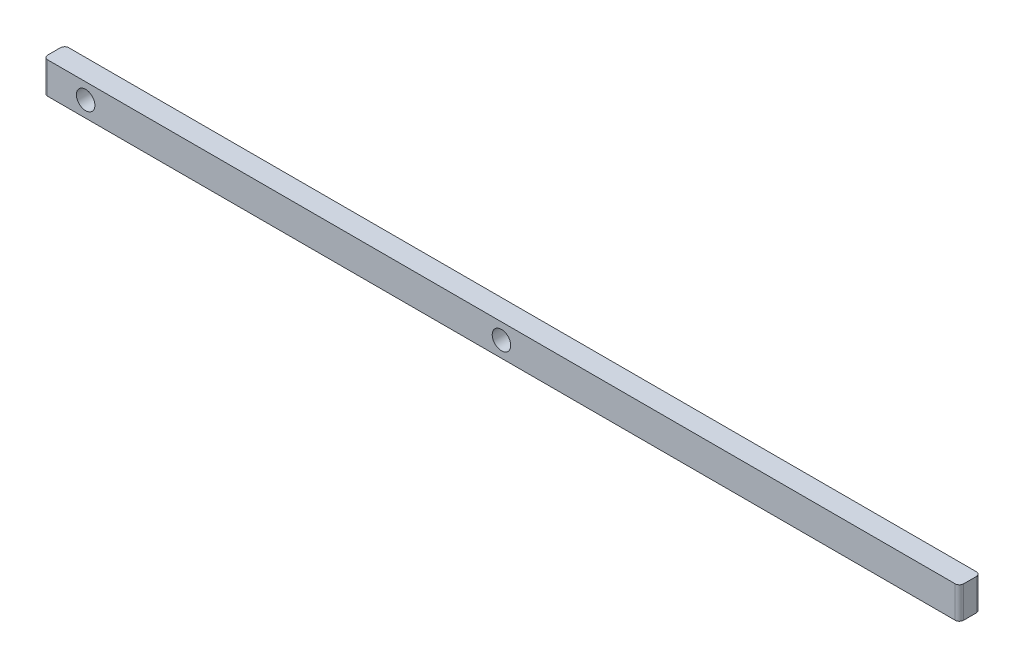
ISO-10303-21;
HEADER;
FILE_DESCRIPTION(('STEP AP214'),'2;1');
FILE_NAME('part.step','',(''),(''),'','','');
FILE_SCHEMA(('AUTOMOTIVE_DESIGN { 1 0 10303 214 1 1 1 1 }'));
ENDSEC;
DATA;
#1=APPLICATION_CONTEXT('core data for automotive mechanical design processes');
#2=APPLICATION_PROTOCOL_DEFINITION('international standard','automotive_design',2000,#1);
#3=PRODUCT_CONTEXT('',#1,'mechanical');
#4=PRODUCT('Part','Part','',(#3));
#5=PRODUCT_RELATED_PRODUCT_CATEGORY('part','',(#4));
#6=PRODUCT_DEFINITION_FORMATION('','',#4);
#7=PRODUCT_DEFINITION_CONTEXT('part definition',#1,'design');
#8=PRODUCT_DEFINITION('design','',#6,#7);
#9=PRODUCT_DEFINITION_SHAPE('','',#8);
#10=(LENGTH_UNIT() NAMED_UNIT(*) SI_UNIT(.MILLI.,.METRE.));
#11=(NAMED_UNIT(*) PLANE_ANGLE_UNIT() SI_UNIT($,.RADIAN.));
#12=(NAMED_UNIT(*) SI_UNIT($,.STERADIAN.) SOLID_ANGLE_UNIT());
#13=UNCERTAINTY_MEASURE_WITH_UNIT(LENGTH_MEASURE(1.E-05),#10,'distance_accuracy_value','');
#14=(GEOMETRIC_REPRESENTATION_CONTEXT(3) GLOBAL_UNCERTAINTY_ASSIGNED_CONTEXT((#13)) GLOBAL_UNIT_ASSIGNED_CONTEXT((#10,
#11,#12)) REPRESENTATION_CONTEXT('',''));
#15=CARTESIAN_POINT('',(0.,0.,0.));
#16=DIRECTION('',(0.,0.,1.));
#17=DIRECTION('',(1.,0.,0.));
#18=AXIS2_PLACEMENT_3D('',#15,#16,#17);
#19=CARTESIAN_POINT('',(276.225,-9.525,6.35));
#20=DIRECTION('',(-1.,0.,0.));
#21=DIRECTION('',(0.,0.,1.));
#22=AXIS2_PLACEMENT_3D('',#19,#20,#21);
#23=PLANE('',#22);
#24=DIRECTION('',(0.,0.,-1.));
#25=VECTOR('',#24,1.);
#26=CARTESIAN_POINT('',(276.225,-9.525,6.35));
#27=LINE('',#26,#25);
#28=CARTESIAN_POINT('',(276.225,-9.525,3.81));
#29=VERTEX_POINT('',#28);
#30=CARTESIAN_POINT('',(276.225,-9.525,-3.81));
#31=VERTEX_POINT('',#30);
#32=EDGE_CURVE('E124',#29,#31,#27,.T.);
#33=ORIENTED_EDGE('',*,*,#32,.T.);
#34=DIRECTION('',(0.,1.,0.));
#35=VECTOR('',#34,1.);
#36=CARTESIAN_POINT('',(276.225,9.525,-3.81));
#37=LINE('',#36,#35);
#38=CARTESIAN_POINT('',(276.225,9.525,-3.81));
#39=VERTEX_POINT('',#38);
#40=EDGE_CURVE('E11',#31,#39,#37,.T.);
#41=ORIENTED_EDGE('',*,*,#40,.T.);
#42=DIRECTION('',(0.,0.,-1.));
#43=VECTOR('',#42,1.);
#44=CARTESIAN_POINT('',(276.225,9.525,6.35));
#45=LINE('',#44,#43);
#46=CARTESIAN_POINT('',(276.225,9.525,3.81));
#47=VERTEX_POINT('',#46);
#48=EDGE_CURVE('E129',#47,#39,#45,.T.);
#49=ORIENTED_EDGE('',*,*,#48,.F.);
#50=DIRECTION('',(0.,1.,0.));
#51=VECTOR('',#50,1.);
#52=CARTESIAN_POINT('',(276.225,-9.525,3.81));
#53=LINE('',#52,#51);
#54=EDGE_CURVE('E44',#47,#29,#53,.F.);
#55=ORIENTED_EDGE('',*,*,#54,.T.);
#56=EDGE_LOOP('',(#33,#41,#49,#55));
#57=FACE_BOUND('',#56,.T.);
#58=ADVANCED_FACE('F36',(#57),#23,.F.);
#59=CARTESIAN_POINT('',(-276.225,9.525,6.35));
#60=DIRECTION('',(0.,-1.,0.));
#61=DIRECTION('',(0.,0.,-1.));
#62=AXIS2_PLACEMENT_3D('',#59,#60,#61);
#63=PLANE('',#62);
#64=DIRECTION('',(-1.,0.,0.));
#65=VECTOR('',#64,1.);
#66=CARTESIAN_POINT('',(-276.225,9.525,-6.35));
#67=LINE('',#66,#65);
#68=CARTESIAN_POINT('',(273.685,9.525,-6.35));
#69=VERTEX_POINT('',#68);
#70=CARTESIAN_POINT('',(-273.685,9.525,-6.35));
#71=VERTEX_POINT('',#70);
#72=EDGE_CURVE('E171',#69,#71,#67,.T.);
#73=ORIENTED_EDGE('',*,*,#72,.T.);
#74=CARTESIAN_POINT('',(-273.685,9.525,-3.81));
#75=DIRECTION('',(0.,-1.,0.));
#76=DIRECTION('',(0.,0.,-1.));
#77=AXIS2_PLACEMENT_3D('',#74,#75,#76);
#78=CIRCLE('',#77,2.54);
#79=CARTESIAN_POINT('',(-276.225,9.525,-3.81));
#80=VERTEX_POINT('',#79);
#81=EDGE_CURVE('E146',#71,#80,#78,.F.);
#82=ORIENTED_EDGE('',*,*,#81,.T.);
#83=DIRECTION('',(0.,0.,-1.));
#84=VECTOR('',#83,1.);
#85=CARTESIAN_POINT('',(-276.225,9.525,6.35));
#86=LINE('',#85,#84);
#87=CARTESIAN_POINT('',(-276.225,9.525,3.81));
#88=VERTEX_POINT('',#87);
#89=EDGE_CURVE('E123',#88,#80,#86,.T.);
#90=ORIENTED_EDGE('',*,*,#89,.F.);
#91=CARTESIAN_POINT('',(-273.685,9.525,3.81));
#92=DIRECTION('',(0.,-1.,0.));
#93=DIRECTION('',(0.,0.,-1.));
#94=AXIS2_PLACEMENT_3D('',#91,#92,#93);
#95=CIRCLE('',#94,2.54);
#96=CARTESIAN_POINT('',(-273.685,9.525,6.35));
#97=VERTEX_POINT('',#96);
#98=EDGE_CURVE('E128',#88,#97,#95,.F.);
#99=ORIENTED_EDGE('',*,*,#98,.T.);
#100=DIRECTION('',(-1.,0.,0.));
#101=VECTOR('',#100,1.);
#102=CARTESIAN_POINT('',(-276.225,9.525,6.35));
#103=LINE('',#102,#101);
#104=CARTESIAN_POINT('',(273.685,9.525,6.35));
#105=VERTEX_POINT('',#104);
#106=EDGE_CURVE('E165',#105,#97,#103,.T.);
#107=ORIENTED_EDGE('',*,*,#106,.F.);
#108=CARTESIAN_POINT('',(273.685,9.525,3.81));
#109=DIRECTION('',(0.,-1.,0.));
#110=DIRECTION('',(0.,0.,-1.));
#111=AXIS2_PLACEMENT_3D('',#108,#109,#110);
#112=CIRCLE('',#111,2.54);
#113=EDGE_CURVE('E58',#105,#47,#112,.F.);
#114=ORIENTED_EDGE('',*,*,#113,.T.);
#115=ORIENTED_EDGE('',*,*,#48,.T.);
#116=CARTESIAN_POINT('',(273.685,9.525,-3.81));
#117=DIRECTION('',(0.,-1.,0.));
#118=DIRECTION('',(0.,0.,-1.));
#119=AXIS2_PLACEMENT_3D('',#116,#117,#118);
#120=CIRCLE('',#119,2.54);
#121=EDGE_CURVE('E51',#39,#69,#120,.F.);
#122=ORIENTED_EDGE('',*,*,#121,.T.);
#123=EDGE_LOOP('',(#73,#82,#90,#99,#107,#114,#115,#122));
#124=FACE_BOUND('',#123,.T.);
#125=ADVANCED_FACE('F167',(#124),#63,.F.);
#126=CARTESIAN_POINT('',(-276.225,-9.525,6.35));
#127=DIRECTION('',(1.,0.,0.));
#128=DIRECTION('',(0.,0.,-1.));
#129=AXIS2_PLACEMENT_3D('',#126,#127,#128);
#130=PLANE('',#129);
#131=ORIENTED_EDGE('',*,*,#89,.T.);
#132=DIRECTION('',(0.,-1.,0.));
#133=VECTOR('',#132,1.);
#134=CARTESIAN_POINT('',(-276.225,-9.525,-3.81));
#135=LINE('',#134,#133);
#136=CARTESIAN_POINT('',(-276.225,-9.525,-3.81));
#137=VERTEX_POINT('',#136);
#138=EDGE_CURVE('E122',#80,#137,#135,.T.);
#139=ORIENTED_EDGE('',*,*,#138,.T.);
#140=DIRECTION('',(0.,0.,-1.));
#141=VECTOR('',#140,1.);
#142=CARTESIAN_POINT('',(-276.225,-9.525,6.35));
#143=LINE('',#142,#141);
#144=CARTESIAN_POINT('',(-276.225,-9.525,3.81));
#145=VERTEX_POINT('',#144);
#146=EDGE_CURVE('E105',#145,#137,#143,.T.);
#147=ORIENTED_EDGE('',*,*,#146,.F.);
#148=DIRECTION('',(0.,-1.,0.));
#149=VECTOR('',#148,1.);
#150=CARTESIAN_POINT('',(-276.225,-9.525,3.81));
#151=LINE('',#150,#149);
#152=EDGE_CURVE('E119',#145,#88,#151,.F.);
#153=ORIENTED_EDGE('',*,*,#152,.T.);
#154=EDGE_LOOP('',(#131,#139,#147,#153));
#155=FACE_BOUND('',#154,.T.);
#156=ADVANCED_FACE('F118',(#155),#130,.F.);
#157=CARTESIAN_POINT('',(-276.225,-9.525,6.35));
#158=DIRECTION('',(0.,1.,0.));
#159=DIRECTION('',(0.,0.,1.));
#160=AXIS2_PLACEMENT_3D('',#157,#158,#159);
#161=PLANE('',#160);
#162=ORIENTED_EDGE('',*,*,#146,.T.);
#163=CARTESIAN_POINT('',(-273.685,-9.525,-3.81));
#164=DIRECTION('',(0.,1.,0.));
#165=DIRECTION('',(0.,0.,1.));
#166=AXIS2_PLACEMENT_3D('',#163,#164,#165);
#167=CIRCLE('',#166,2.54);
#168=CARTESIAN_POINT('',(-273.685,-9.525,-6.35));
#169=VERTEX_POINT('',#168);
#170=EDGE_CURVE('E112',#137,#169,#167,.F.);
#171=ORIENTED_EDGE('',*,*,#170,.T.);
#172=DIRECTION('',(1.,0.,0.));
#173=VECTOR('',#172,1.);
#174=CARTESIAN_POINT('',(-276.225,-9.525,-6.35));
#175=LINE('',#174,#173);
#176=CARTESIAN_POINT('',(273.685,-9.525,-6.35));
#177=VERTEX_POINT('',#176);
#178=EDGE_CURVE('E168',#169,#177,#175,.T.);
#179=ORIENTED_EDGE('',*,*,#178,.T.);
#180=CARTESIAN_POINT('',(273.685,-9.525,-3.81));
#181=DIRECTION('',(0.,1.,0.));
#182=DIRECTION('',(0.,0.,1.));
#183=AXIS2_PLACEMENT_3D('',#180,#181,#182);
#184=CIRCLE('',#183,2.54);
#185=EDGE_CURVE('E113',#177,#31,#184,.F.);
#186=ORIENTED_EDGE('',*,*,#185,.T.);
#187=ORIENTED_EDGE('',*,*,#32,.F.);
#188=CARTESIAN_POINT('',(273.685,-9.525,3.81));
#189=DIRECTION('',(0.,1.,0.));
#190=DIRECTION('',(0.,0.,1.));
#191=AXIS2_PLACEMENT_3D('',#188,#189,#190);
#192=CIRCLE('',#191,2.54);
#193=CARTESIAN_POINT('',(273.685,-9.525,6.35));
#194=VERTEX_POINT('',#193);
#195=EDGE_CURVE('E131',#29,#194,#192,.F.);
#196=ORIENTED_EDGE('',*,*,#195,.T.);
#197=DIRECTION('',(1.,0.,0.));
#198=VECTOR('',#197,1.);
#199=CARTESIAN_POINT('',(-276.225,-9.525,6.35));
#200=LINE('',#199,#198);
#201=CARTESIAN_POINT('',(-273.685,-9.525,6.35));
#202=VERTEX_POINT('',#201);
#203=EDGE_CURVE('E107',#202,#194,#200,.T.);
#204=ORIENTED_EDGE('',*,*,#203,.F.);
#205=CARTESIAN_POINT('',(-273.685,-9.525,3.81));
#206=DIRECTION('',(0.,1.,0.));
#207=DIRECTION('',(0.,0.,1.));
#208=AXIS2_PLACEMENT_3D('',#205,#206,#207);
#209=CIRCLE('',#208,2.54);
#210=EDGE_CURVE('E102',#202,#145,#209,.F.);
#211=ORIENTED_EDGE('',*,*,#210,.T.);
#212=EDGE_LOOP('',(#162,#171,#179,#186,#187,#196,#204,#211));
#213=FACE_BOUND('',#212,.T.);
#214=ADVANCED_FACE('F104',(#213),#161,.F.);
#215=CARTESIAN_POINT('',(0.,0.,6.35));
#216=DIRECTION('',(0.,0.,-1.));
#217=DIRECTION('',(-1.,0.,0.));
#218=AXIS2_PLACEMENT_3D('',#215,#216,#217);
#219=PLANE('',#218);
#220=CARTESIAN_POINT('',(-250.825,0.,6.35));
#221=DIRECTION('',(0.,0.,-1.));
#222=DIRECTION('',(-1.,0.,0.));
#223=AXIS2_PLACEMENT_3D('',#220,#221,#222);
#224=CIRCLE('',#223,5.58800000000002);
#225=CARTESIAN_POINT('',(-256.413,0.,6.35));
#226=VERTEX_POINT('',#225);
#227=EDGE_CURVE('E174',#226,#226,#224,.T.);
#228=ORIENTED_EDGE('',*,*,#227,.T.);
#229=EDGE_LOOP('',(#228));
#230=FACE_BOUND('',#229,.T.);
#231=CARTESIAN_POINT('',(0.,0.,6.35));
#232=DIRECTION('',(0.,0.,-1.));
#233=DIRECTION('',(-1.,0.,0.));
#234=AXIS2_PLACEMENT_3D('',#231,#232,#233);
#235=CIRCLE('',#234,5.588);
#236=CARTESIAN_POINT('',(-5.588,0.,6.35));
#237=VERTEX_POINT('',#236);
#238=EDGE_CURVE('E295',#237,#237,#235,.T.);
#239=ORIENTED_EDGE('',*,*,#238,.T.);
#240=EDGE_LOOP('',(#239));
#241=FACE_BOUND('',#240,.T.);
#242=ORIENTED_EDGE('',*,*,#106,.T.);
#243=DIRECTION('',(0.,-1.,0.));
#244=VECTOR('',#243,1.);
#245=CARTESIAN_POINT('',(-273.685,0.,6.35));
#246=LINE('',#245,#244);
#247=EDGE_CURVE('E151',#97,#202,#246,.T.);
#248=ORIENTED_EDGE('',*,*,#247,.T.);
#249=ORIENTED_EDGE('',*,*,#203,.T.);
#250=DIRECTION('',(0.,1.,0.));
#251=VECTOR('',#250,1.);
#252=CARTESIAN_POINT('',(273.685,0.,6.35));
#253=LINE('',#252,#251);
#254=EDGE_CURVE('E148',#194,#105,#253,.T.);
#255=ORIENTED_EDGE('',*,*,#254,.T.);
#256=EDGE_LOOP('',(#242,#248,#249,#255));
#257=FACE_BOUND('',#256,.T.);
#258=ADVANCED_FACE('F164',(#230,#241,#257),#219,.F.);
#259=CARTESIAN_POINT('',(0.,0.,-6.35));
#260=DIRECTION('',(0.,0.,-1.));
#261=DIRECTION('',(-1.,0.,0.));
#262=AXIS2_PLACEMENT_3D('',#259,#260,#261);
#263=PLANE('',#262);
#264=CARTESIAN_POINT('',(-250.825,0.,-6.35));
#265=DIRECTION('',(0.,0.,1.));
#266=DIRECTION('',(1.,0.,0.));
#267=AXIS2_PLACEMENT_3D('',#264,#265,#266);
#268=CIRCLE('',#267,5.58800000000002);
#269=CARTESIAN_POINT('',(-245.237,0.,-6.35));
#270=VERTEX_POINT('',#269);
#271=EDGE_CURVE('E290',#270,#270,#268,.T.);
#272=ORIENTED_EDGE('',*,*,#271,.T.);
#273=EDGE_LOOP('',(#272));
#274=FACE_BOUND('',#273,.T.);
#275=CARTESIAN_POINT('',(0.,0.,-6.35));
#276=DIRECTION('',(0.,0.,1.));
#277=DIRECTION('',(1.,0.,0.));
#278=AXIS2_PLACEMENT_3D('',#275,#276,#277);
#279=CIRCLE('',#278,5.588);
#280=CARTESIAN_POINT('',(5.588,0.,-6.35));
#281=VERTEX_POINT('',#280);
#282=EDGE_CURVE('E293',#281,#281,#279,.T.);
#283=ORIENTED_EDGE('',*,*,#282,.T.);
#284=EDGE_LOOP('',(#283));
#285=FACE_BOUND('',#284,.T.);
#286=ORIENTED_EDGE('',*,*,#178,.F.);
#287=DIRECTION('',(0.,-1.,0.));
#288=VECTOR('',#287,1.);
#289=CARTESIAN_POINT('',(-273.685,9.525,-6.35));
#290=LINE('',#289,#288);
#291=EDGE_CURVE('E141',#169,#71,#290,.F.);
#292=ORIENTED_EDGE('',*,*,#291,.T.);
#293=ORIENTED_EDGE('',*,*,#72,.F.);
#294=DIRECTION('',(0.,1.,0.));
#295=VECTOR('',#294,1.);
#296=CARTESIAN_POINT('',(273.685,-9.525,-6.35));
#297=LINE('',#296,#295);
#298=EDGE_CURVE('E139',#69,#177,#297,.F.);
#299=ORIENTED_EDGE('',*,*,#298,.T.);
#300=EDGE_LOOP('',(#286,#292,#293,#299));
#301=FACE_BOUND('',#300,.T.);
#302=ADVANCED_FACE('F183',(#274,#285,#301),#263,.T.);
#303=CARTESIAN_POINT('',(0.,0.,-6.35));
#304=DIRECTION('',(0.,0.,1.));
#305=DIRECTION('',(1.,0.,0.));
#306=AXIS2_PLACEMENT_3D('',#303,#304,#305);
#307=CYLINDRICAL_SURFACE('',#306,5.588);
#308=ORIENTED_EDGE('',*,*,#282,.F.);
#309=EDGE_LOOP('',(#308));
#310=FACE_BOUND('',#309,.T.);
#311=ORIENTED_EDGE('',*,*,#238,.F.);
#312=EDGE_LOOP('',(#311));
#313=FACE_BOUND('',#312,.T.);
#314=ADVANCED_FACE('F205',(#310,#313),#307,.F.);
#315=CARTESIAN_POINT('',(-250.825,0.,-6.35));
#316=DIRECTION('',(0.,0.,1.));
#317=DIRECTION('',(1.,0.,0.));
#318=AXIS2_PLACEMENT_3D('',#315,#316,#317);
#319=CYLINDRICAL_SURFACE('',#318,5.58800000000002);
#320=ORIENTED_EDGE('',*,*,#271,.F.);
#321=EDGE_LOOP('',(#320));
#322=FACE_BOUND('',#321,.T.);
#323=ORIENTED_EDGE('',*,*,#227,.F.);
#324=EDGE_LOOP('',(#323));
#325=FACE_BOUND('',#324,.T.);
#326=ADVANCED_FACE('F201',(#322,#325),#319,.F.);
#327=CARTESIAN_POINT('',(-273.685,-9.525,-3.81));
#328=DIRECTION('',(0.,1.,0.));
#329=DIRECTION('',(0.,0.,1.));
#330=AXIS2_PLACEMENT_3D('',#327,#328,#329);
#331=CYLINDRICAL_SURFACE('',#330,2.54);
#332=ORIENTED_EDGE('',*,*,#81,.F.);
#333=ORIENTED_EDGE('',*,*,#291,.F.);
#334=ORIENTED_EDGE('',*,*,#170,.F.);
#335=ORIENTED_EDGE('',*,*,#138,.F.);
#336=EDGE_LOOP('',(#332,#333,#334,#335));
#337=FACE_BOUND('',#336,.T.);
#338=ADVANCED_FACE('F179',(#337),#331,.T.);
#339=CARTESIAN_POINT('',(-273.685,0.,3.81));
#340=DIRECTION('',(0.,-1.,0.));
#341=DIRECTION('',(0.,0.,-1.));
#342=AXIS2_PLACEMENT_3D('',#339,#340,#341);
#343=CYLINDRICAL_SURFACE('',#342,2.54);
#344=ORIENTED_EDGE('',*,*,#98,.F.);
#345=ORIENTED_EDGE('',*,*,#152,.F.);
#346=ORIENTED_EDGE('',*,*,#210,.F.);
#347=ORIENTED_EDGE('',*,*,#247,.F.);
#348=EDGE_LOOP('',(#344,#345,#346,#347));
#349=FACE_BOUND('',#348,.T.);
#350=ADVANCED_FACE('F127',(#349),#343,.T.);
#351=CARTESIAN_POINT('',(273.685,-9.525,-3.81));
#352=DIRECTION('',(0.,-1.,0.));
#353=DIRECTION('',(0.,0.,-1.));
#354=AXIS2_PLACEMENT_3D('',#351,#352,#353);
#355=CYLINDRICAL_SURFACE('',#354,2.54);
#356=ORIENTED_EDGE('',*,*,#185,.F.);
#357=ORIENTED_EDGE('',*,*,#298,.F.);
#358=ORIENTED_EDGE('',*,*,#121,.F.);
#359=ORIENTED_EDGE('',*,*,#40,.F.);
#360=EDGE_LOOP('',(#356,#357,#358,#359));
#361=FACE_BOUND('',#360,.T.);
#362=ADVANCED_FACE('F185',(#361),#355,.T.);
#363=CARTESIAN_POINT('',(273.685,0.,3.81));
#364=DIRECTION('',(0.,1.,0.));
#365=DIRECTION('',(0.,0.,1.));
#366=AXIS2_PLACEMENT_3D('',#363,#364,#365);
#367=CYLINDRICAL_SURFACE('',#366,2.54);
#368=ORIENTED_EDGE('',*,*,#195,.F.);
#369=ORIENTED_EDGE('',*,*,#54,.F.);
#370=ORIENTED_EDGE('',*,*,#113,.F.);
#371=ORIENTED_EDGE('',*,*,#254,.F.);
#372=EDGE_LOOP('',(#368,#369,#370,#371));
#373=FACE_BOUND('',#372,.T.);
#374=ADVANCED_FACE('F38',(#373),#367,.T.);
#375=CLOSED_SHELL('',(#58,#125,#156,#214,#258,#302,#314,#326,#338,#350,#362,#374));
#376=MANIFOLD_SOLID_BREP('B2',#375);
#377=ADVANCED_BREP_SHAPE_REPRESENTATION('',(#18,#376),#14);
#378=SHAPE_DEFINITION_REPRESENTATION(#9,#377);
ENDSEC;
END-ISO-10303-21;
